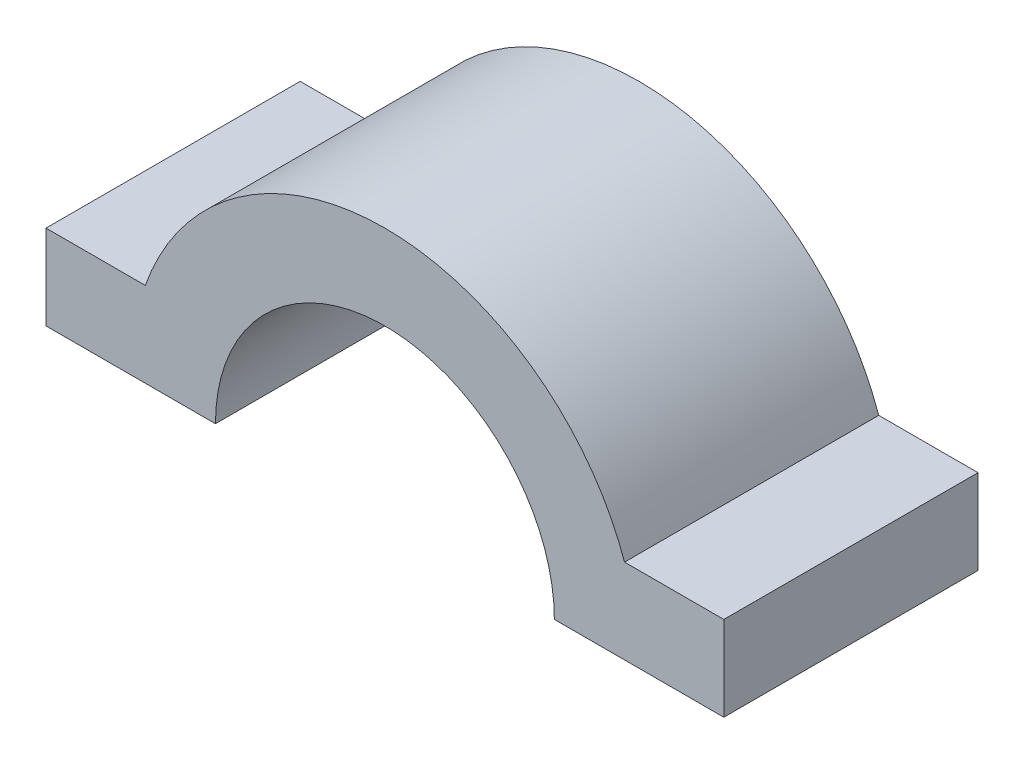
ISO-10303-21;
HEADER;
FILE_DESCRIPTION(('STEP AP214'),'2;1');
FILE_NAME('part.step','',(''),(''),'','','');
FILE_SCHEMA(('AUTOMOTIVE_DESIGN { 1 0 10303 214 1 1 1 1 }'));
ENDSEC;
DATA;
#1=APPLICATION_CONTEXT('core data for automotive mechanical design processes');
#2=APPLICATION_PROTOCOL_DEFINITION('international standard','automotive_design',2000,#1);
#3=PRODUCT_CONTEXT('',#1,'mechanical');
#4=PRODUCT('Part','Part','',(#3));
#5=PRODUCT_RELATED_PRODUCT_CATEGORY('part','',(#4));
#6=PRODUCT_DEFINITION_FORMATION('','',#4);
#7=PRODUCT_DEFINITION_CONTEXT('part definition',#1,'design');
#8=PRODUCT_DEFINITION('design','',#6,#7);
#9=PRODUCT_DEFINITION_SHAPE('','',#8);
#10=(LENGTH_UNIT() NAMED_UNIT(*) SI_UNIT(.MILLI.,.METRE.));
#11=(NAMED_UNIT(*) PLANE_ANGLE_UNIT() SI_UNIT($,.RADIAN.));
#12=(NAMED_UNIT(*) SI_UNIT($,.STERADIAN.) SOLID_ANGLE_UNIT());
#13=UNCERTAINTY_MEASURE_WITH_UNIT(LENGTH_MEASURE(1.E-05),#10,'distance_accuracy_value','');
#14=(GEOMETRIC_REPRESENTATION_CONTEXT(3) GLOBAL_UNCERTAINTY_ASSIGNED_CONTEXT((#13)) GLOBAL_UNIT_ASSIGNED_CONTEXT((#10,
#11,#12)) REPRESENTATION_CONTEXT('',''));
#15=CARTESIAN_POINT('',(0.,0.,0.));
#16=DIRECTION('',(0.,0.,1.));
#17=DIRECTION('',(1.,0.,0.));
#18=AXIS2_PLACEMENT_3D('',#15,#16,#17);
#19=CARTESIAN_POINT('',(-20.,5.,-15.));
#20=DIRECTION('',(0.,1.,0.));
#21=DIRECTION('',(0.,0.,1.));
#22=AXIS2_PLACEMENT_3D('',#19,#20,#21);
#23=PLANE('',#22);
#24=DIRECTION('',(-1.,0.,0.));
#25=VECTOR('',#24,1.);
#26=CARTESIAN_POINT('',(-20.,5.,0.));
#27=LINE('',#26,#25);
#28=CARTESIAN_POINT('',(-14.1421356237309,5.,0.));
#29=VERTEX_POINT('',#28);
#30=CARTESIAN_POINT('',(-20.,5.,0.));
#31=VERTEX_POINT('',#30);
#32=EDGE_CURVE('E144',#29,#31,#27,.T.);
#33=ORIENTED_EDGE('',*,*,#32,.F.);
#34=DIRECTION('',(0.,0.,1.));
#35=VECTOR('',#34,1.);
#36=CARTESIAN_POINT('',(-14.1421356237309,5.,-15.));
#37=LINE('',#36,#35);
#38=CARTESIAN_POINT('',(-14.1421356237309,5.,-15.));
#39=VERTEX_POINT('',#38);
#40=EDGE_CURVE('E11',#39,#29,#37,.T.);
#41=ORIENTED_EDGE('',*,*,#40,.F.);
#42=DIRECTION('',(-1.,0.,0.));
#43=VECTOR('',#42,1.);
#44=CARTESIAN_POINT('',(-20.,5.,-15.));
#45=LINE('',#44,#43);
#46=CARTESIAN_POINT('',(-20.,5.,-15.));
#47=VERTEX_POINT('',#46);
#48=EDGE_CURVE('E172',#39,#47,#45,.T.);
#49=ORIENTED_EDGE('',*,*,#48,.T.);
#50=DIRECTION('',(0.,0.,1.));
#51=VECTOR('',#50,1.);
#52=CARTESIAN_POINT('',(-20.,5.,-15.));
#53=LINE('',#52,#51);
#54=EDGE_CURVE('E44',#47,#31,#53,.T.);
#55=ORIENTED_EDGE('',*,*,#54,.T.);
#56=EDGE_LOOP('',(#33,#41,#49,#55));
#57=FACE_BOUND('',#56,.T.);
#58=ADVANCED_FACE('F41',(#57),#23,.T.);
#59=CARTESIAN_POINT('',(0.,0.,-15.));
#60=DIRECTION('',(0.,0.,1.));
#61=DIRECTION('',(1.,0.,0.));
#62=AXIS2_PLACEMENT_3D('',#59,#60,#61);
#63=CYLINDRICAL_SURFACE('',#62,15.);
#64=CARTESIAN_POINT('',(0.,0.,0.));
#65=DIRECTION('',(0.,0.,1.));
#66=DIRECTION('',(-1.,0.,0.));
#67=AXIS2_PLACEMENT_3D('',#64,#65,#66);
#68=CIRCLE('',#67,15.);
#69=CARTESIAN_POINT('',(14.142135623731,5.,0.));
#70=VERTEX_POINT('',#69);
#71=EDGE_CURVE('E169',#70,#29,#68,.T.);
#72=ORIENTED_EDGE('',*,*,#71,.F.);
#73=DIRECTION('',(0.,0.,1.));
#74=VECTOR('',#73,1.);
#75=CARTESIAN_POINT('',(14.142135623731,5.,-15.));
#76=LINE('',#75,#74);
#77=CARTESIAN_POINT('',(14.142135623731,5.,-15.));
#78=VERTEX_POINT('',#77);
#79=EDGE_CURVE('E51',#78,#70,#76,.T.);
#80=ORIENTED_EDGE('',*,*,#79,.F.);
#81=CARTESIAN_POINT('',(0.,0.,-15.));
#82=DIRECTION('',(0.,0.,1.));
#83=DIRECTION('',(-1.,0.,0.));
#84=AXIS2_PLACEMENT_3D('',#81,#82,#83);
#85=CIRCLE('',#84,15.);
#86=EDGE_CURVE('E130',#78,#39,#85,.T.);
#87=ORIENTED_EDGE('',*,*,#86,.T.);
#88=ORIENTED_EDGE('',*,*,#40,.T.);
#89=EDGE_LOOP('',(#72,#80,#87,#88));
#90=FACE_BOUND('',#89,.T.);
#91=ADVANCED_FACE('F190',(#90),#63,.T.);
#92=CARTESIAN_POINT('',(20.,5.,-15.));
#93=DIRECTION('',(0.,1.,0.));
#94=DIRECTION('',(-1.,0.,0.));
#95=AXIS2_PLACEMENT_3D('',#92,#93,#94);
#96=PLANE('',#95);
#97=DIRECTION('',(-1.,0.,0.));
#98=VECTOR('',#97,1.);
#99=CARTESIAN_POINT('',(20.,5.,0.));
#100=LINE('',#99,#98);
#101=CARTESIAN_POINT('',(20.,5.,0.));
#102=VERTEX_POINT('',#101);
#103=EDGE_CURVE('E116',#102,#70,#100,.T.);
#104=ORIENTED_EDGE('',*,*,#103,.F.);
#105=DIRECTION('',(0.,0.,1.));
#106=VECTOR('',#105,1.);
#107=CARTESIAN_POINT('',(20.,5.,-15.));
#108=LINE('',#107,#106);
#109=CARTESIAN_POINT('',(20.,5.,-15.));
#110=VERTEX_POINT('',#109);
#111=EDGE_CURVE('E111',#110,#102,#108,.T.);
#112=ORIENTED_EDGE('',*,*,#111,.F.);
#113=DIRECTION('',(-1.,0.,0.));
#114=VECTOR('',#113,1.);
#115=CARTESIAN_POINT('',(20.,5.,-15.));
#116=LINE('',#115,#114);
#117=EDGE_CURVE('E114',#110,#78,#116,.T.);
#118=ORIENTED_EDGE('',*,*,#117,.T.);
#119=ORIENTED_EDGE('',*,*,#79,.T.);
#120=EDGE_LOOP('',(#104,#112,#118,#119));
#121=FACE_BOUND('',#120,.T.);
#122=ADVANCED_FACE('F113',(#121),#96,.T.);
#123=CARTESIAN_POINT('',(20.,0.,-15.));
#124=DIRECTION('',(1.,0.,0.));
#125=DIRECTION('',(0.,0.,-1.));
#126=AXIS2_PLACEMENT_3D('',#123,#124,#125);
#127=PLANE('',#126);
#128=DIRECTION('',(0.,1.,0.));
#129=VECTOR('',#128,1.);
#130=CARTESIAN_POINT('',(20.,0.,0.));
#131=LINE('',#130,#129);
#132=CARTESIAN_POINT('',(20.,0.,0.));
#133=VERTEX_POINT('',#132);
#134=EDGE_CURVE('E164',#133,#102,#131,.T.);
#135=ORIENTED_EDGE('',*,*,#134,.F.);
#136=DIRECTION('',(0.,0.,1.));
#137=VECTOR('',#136,1.);
#138=CARTESIAN_POINT('',(20.,0.,-15.));
#139=LINE('',#138,#137);
#140=CARTESIAN_POINT('',(20.,0.,-15.));
#141=VERTEX_POINT('',#140);
#142=EDGE_CURVE('E122',#141,#133,#139,.T.);
#143=ORIENTED_EDGE('',*,*,#142,.F.);
#144=DIRECTION('',(0.,1.,0.));
#145=VECTOR('',#144,1.);
#146=CARTESIAN_POINT('',(20.,0.,-15.));
#147=LINE('',#146,#145);
#148=EDGE_CURVE('E128',#141,#110,#147,.T.);
#149=ORIENTED_EDGE('',*,*,#148,.T.);
#150=ORIENTED_EDGE('',*,*,#111,.T.);
#151=EDGE_LOOP('',(#135,#143,#149,#150));
#152=FACE_BOUND('',#151,.T.);
#153=ADVANCED_FACE('F133',(#152),#127,.T.);
#154=CARTESIAN_POINT('',(10.,0.,-15.));
#155=DIRECTION('',(0.,-1.,0.));
#156=DIRECTION('',(0.,0.,-1.));
#157=AXIS2_PLACEMENT_3D('',#154,#155,#156);
#158=PLANE('',#157);
#159=DIRECTION('',(1.,0.,0.));
#160=VECTOR('',#159,1.);
#161=CARTESIAN_POINT('',(10.,0.,0.));
#162=LINE('',#161,#160);
#163=CARTESIAN_POINT('',(10.,0.,0.));
#164=VERTEX_POINT('',#163);
#165=EDGE_CURVE('E160',#164,#133,#162,.T.);
#166=ORIENTED_EDGE('',*,*,#165,.F.);
#167=DIRECTION('',(0.,0.,1.));
#168=VECTOR('',#167,1.);
#169=CARTESIAN_POINT('',(10.,0.,-15.));
#170=LINE('',#169,#168);
#171=CARTESIAN_POINT('',(10.,0.,-15.));
#172=VERTEX_POINT('',#171);
#173=EDGE_CURVE('E178',#172,#164,#170,.T.);
#174=ORIENTED_EDGE('',*,*,#173,.F.);
#175=DIRECTION('',(1.,0.,0.));
#176=VECTOR('',#175,1.);
#177=CARTESIAN_POINT('',(10.,0.,-15.));
#178=LINE('',#177,#176);
#179=EDGE_CURVE('E135',#172,#141,#178,.T.);
#180=ORIENTED_EDGE('',*,*,#179,.T.);
#181=ORIENTED_EDGE('',*,*,#142,.T.);
#182=EDGE_LOOP('',(#166,#174,#180,#181));
#183=FACE_BOUND('',#182,.T.);
#184=ADVANCED_FACE('F203',(#183),#158,.T.);
#185=CARTESIAN_POINT('',(0.,0.,-15.));
#186=DIRECTION('',(0.,0.,1.));
#187=DIRECTION('',(1.,0.,0.));
#188=AXIS2_PLACEMENT_3D('',#185,#186,#187);
#189=CYLINDRICAL_SURFACE('',#188,10.);
#190=CARTESIAN_POINT('',(0.,0.,0.));
#191=DIRECTION('',(0.,0.,-1.));
#192=DIRECTION('',(1.,0.,0.));
#193=AXIS2_PLACEMENT_3D('',#190,#191,#192);
#194=CIRCLE('',#193,10.);
#195=CARTESIAN_POINT('',(-10.,0.,0.));
#196=VERTEX_POINT('',#195);
#197=EDGE_CURVE('E156',#196,#164,#194,.T.);
#198=ORIENTED_EDGE('',*,*,#197,.F.);
#199=DIRECTION('',(0.,0.,1.));
#200=VECTOR('',#199,1.);
#201=CARTESIAN_POINT('',(-10.,0.,-15.));
#202=LINE('',#201,#200);
#203=CARTESIAN_POINT('',(-10.,0.,-15.));
#204=VERTEX_POINT('',#203);
#205=EDGE_CURVE('E181',#204,#196,#202,.T.);
#206=ORIENTED_EDGE('',*,*,#205,.F.);
#207=CARTESIAN_POINT('',(0.,0.,-15.));
#208=DIRECTION('',(0.,0.,-1.));
#209=DIRECTION('',(1.,0.,0.));
#210=AXIS2_PLACEMENT_3D('',#207,#208,#209);
#211=CIRCLE('',#210,10.);
#212=EDGE_CURVE('E138',#204,#172,#211,.T.);
#213=ORIENTED_EDGE('',*,*,#212,.T.);
#214=ORIENTED_EDGE('',*,*,#173,.T.);
#215=EDGE_LOOP('',(#198,#206,#213,#214));
#216=FACE_BOUND('',#215,.T.);
#217=ADVANCED_FACE('F206',(#216),#189,.F.);
#218=CARTESIAN_POINT('',(-10.,0.,-15.));
#219=DIRECTION('',(0.,-1.,0.));
#220=DIRECTION('',(1.,0.,0.));
#221=AXIS2_PLACEMENT_3D('',#218,#219,#220);
#222=PLANE('',#221);
#223=DIRECTION('',(1.,0.,0.));
#224=VECTOR('',#223,1.);
#225=CARTESIAN_POINT('',(-10.,0.,0.));
#226=LINE('',#225,#224);
#227=CARTESIAN_POINT('',(-20.,0.,0.));
#228=VERTEX_POINT('',#227);
#229=EDGE_CURVE('E152',#228,#196,#226,.T.);
#230=ORIENTED_EDGE('',*,*,#229,.F.);
#231=DIRECTION('',(0.,0.,1.));
#232=VECTOR('',#231,1.);
#233=CARTESIAN_POINT('',(-20.,0.,-15.));
#234=LINE('',#233,#232);
#235=CARTESIAN_POINT('',(-20.,0.,-15.));
#236=VERTEX_POINT('',#235);
#237=EDGE_CURVE('E183',#236,#228,#234,.T.);
#238=ORIENTED_EDGE('',*,*,#237,.F.);
#239=DIRECTION('',(1.,0.,0.));
#240=VECTOR('',#239,1.);
#241=CARTESIAN_POINT('',(-10.,0.,-15.));
#242=LINE('',#241,#240);
#243=EDGE_CURVE('E281',#236,#204,#242,.T.);
#244=ORIENTED_EDGE('',*,*,#243,.T.);
#245=ORIENTED_EDGE('',*,*,#205,.T.);
#246=EDGE_LOOP('',(#230,#238,#244,#245));
#247=FACE_BOUND('',#246,.T.);
#248=ADVANCED_FACE('F210',(#247),#222,.T.);
#249=CARTESIAN_POINT('',(-20.,0.,-15.));
#250=DIRECTION('',(-1.,0.,0.));
#251=DIRECTION('',(0.,0.,1.));
#252=AXIS2_PLACEMENT_3D('',#249,#250,#251);
#253=PLANE('',#252);
#254=DIRECTION('',(0.,-1.,0.));
#255=VECTOR('',#254,1.);
#256=CARTESIAN_POINT('',(-20.,0.,0.));
#257=LINE('',#256,#255);
#258=EDGE_CURVE('E148',#31,#228,#257,.T.);
#259=ORIENTED_EDGE('',*,*,#258,.F.);
#260=ORIENTED_EDGE('',*,*,#54,.F.);
#261=DIRECTION('',(0.,-1.,0.));
#262=VECTOR('',#261,1.);
#263=CARTESIAN_POINT('',(-20.,0.,-15.));
#264=LINE('',#263,#262);
#265=EDGE_CURVE('E284',#47,#236,#264,.T.);
#266=ORIENTED_EDGE('',*,*,#265,.T.);
#267=ORIENTED_EDGE('',*,*,#237,.T.);
#268=EDGE_LOOP('',(#259,#260,#266,#267));
#269=FACE_BOUND('',#268,.T.);
#270=ADVANCED_FACE('F187',(#269),#253,.T.);
#271=CARTESIAN_POINT('',(0.,0.,-15.));
#272=DIRECTION('',(0.,0.,-1.));
#273=DIRECTION('',(-1.,0.,0.));
#274=AXIS2_PLACEMENT_3D('',#271,#272,#273);
#275=PLANE('',#274);
#276=ORIENTED_EDGE('',*,*,#48,.F.);
#277=ORIENTED_EDGE('',*,*,#86,.F.);
#278=ORIENTED_EDGE('',*,*,#117,.F.);
#279=ORIENTED_EDGE('',*,*,#148,.F.);
#280=ORIENTED_EDGE('',*,*,#179,.F.);
#281=ORIENTED_EDGE('',*,*,#212,.F.);
#282=ORIENTED_EDGE('',*,*,#243,.F.);
#283=ORIENTED_EDGE('',*,*,#265,.F.);
#284=EDGE_LOOP('',(#276,#277,#278,#279,#280,#281,#282,#283));
#285=FACE_BOUND('',#284,.T.);
#286=ADVANCED_FACE('F126',(#285),#275,.T.);
#287=CARTESIAN_POINT('',(0.,0.,0.));
#288=DIRECTION('',(0.,0.,-1.));
#289=DIRECTION('',(-1.,0.,0.));
#290=AXIS2_PLACEMENT_3D('',#287,#288,#289);
#291=PLANE('',#290);
#292=ORIENTED_EDGE('',*,*,#32,.T.);
#293=ORIENTED_EDGE('',*,*,#258,.T.);
#294=ORIENTED_EDGE('',*,*,#229,.T.);
#295=ORIENTED_EDGE('',*,*,#197,.T.);
#296=ORIENTED_EDGE('',*,*,#165,.T.);
#297=ORIENTED_EDGE('',*,*,#134,.T.);
#298=ORIENTED_EDGE('',*,*,#103,.T.);
#299=ORIENTED_EDGE('',*,*,#71,.T.);
#300=EDGE_LOOP('',(#292,#293,#294,#295,#296,#297,#298,#299));
#301=FACE_BOUND('',#300,.T.);
#302=ADVANCED_FACE('F189',(#301),#291,.F.);
#303=CLOSED_SHELL('',(#58,#91,#122,#153,#184,#217,#248,#270,#286,#302));
#304=MANIFOLD_SOLID_BREP('B2',#303);
#305=ADVANCED_BREP_SHAPE_REPRESENTATION('',(#18,#304),#14);
#306=SHAPE_DEFINITION_REPRESENTATION(#9,#305);
ENDSEC;
END-ISO-10303-21;
